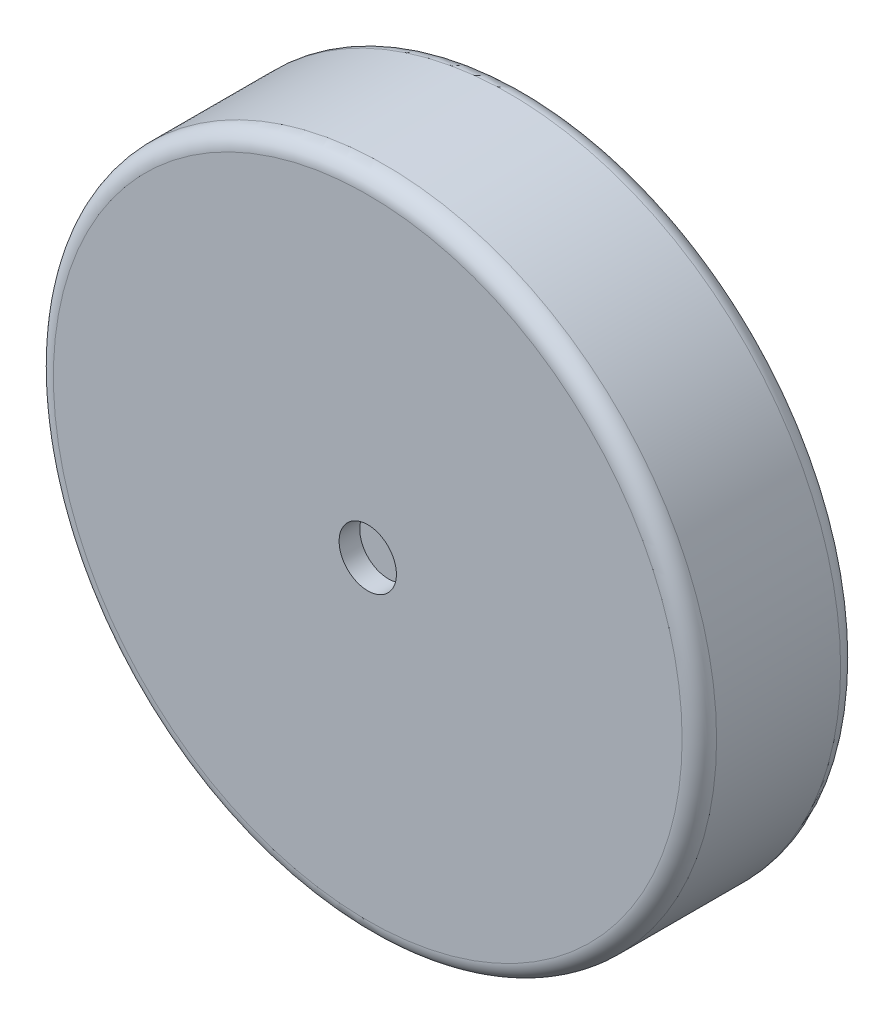
ISO-10303-21;
HEADER;
FILE_DESCRIPTION(('STEP AP214'),'2;1');
FILE_NAME('part.step','',(''),(''),'','','');
FILE_SCHEMA(('AUTOMOTIVE_DESIGN { 1 0 10303 214 1 1 1 1 }'));
ENDSEC;
DATA;
#1=APPLICATION_CONTEXT('core data for automotive mechanical design processes');
#2=APPLICATION_PROTOCOL_DEFINITION('international standard','automotive_design',2000,#1);
#3=PRODUCT_CONTEXT('',#1,'mechanical');
#4=PRODUCT('Part','Part','',(#3));
#5=PRODUCT_RELATED_PRODUCT_CATEGORY('part','',(#4));
#6=PRODUCT_DEFINITION_FORMATION('','',#4);
#7=PRODUCT_DEFINITION_CONTEXT('part definition',#1,'design');
#8=PRODUCT_DEFINITION('design','',#6,#7);
#9=PRODUCT_DEFINITION_SHAPE('','',#8);
#10=(LENGTH_UNIT() NAMED_UNIT(*) SI_UNIT(.MILLI.,.METRE.));
#11=(NAMED_UNIT(*) PLANE_ANGLE_UNIT() SI_UNIT($,.RADIAN.));
#12=(NAMED_UNIT(*) SI_UNIT($,.STERADIAN.) SOLID_ANGLE_UNIT());
#13=UNCERTAINTY_MEASURE_WITH_UNIT(LENGTH_MEASURE(1.E-05),#10,'distance_accuracy_value','');
#14=(GEOMETRIC_REPRESENTATION_CONTEXT(3) GLOBAL_UNCERTAINTY_ASSIGNED_CONTEXT((#13)) GLOBAL_UNIT_ASSIGNED_CONTEXT((#10,
#11,#12)) REPRESENTATION_CONTEXT('',''));
#15=CARTESIAN_POINT('',(0.,0.,0.));
#16=DIRECTION('',(0.,0.,1.));
#17=DIRECTION('',(1.,0.,0.));
#18=AXIS2_PLACEMENT_3D('',#15,#16,#17);
#19=CARTESIAN_POINT('',(0.,0.,23.368));
#20=DIRECTION('',(0.,0.,-1.));
#21=DIRECTION('',(-1.,0.,0.));
#22=AXIS2_PLACEMENT_3D('',#19,#20,#21);
#23=CYLINDRICAL_SURFACE('',#22,48.895);
#24=CARTESIAN_POINT('',(0.,0.,2.54));
#25=DIRECTION('',(0.,0.,1.));
#26=DIRECTION('',(1.,0.,0.));
#27=AXIS2_PLACEMENT_3D('',#24,#25,#26);
#28=CIRCLE('',#27,48.895);
#29=CARTESIAN_POINT('',(48.895,0.,2.54));
#30=VERTEX_POINT('',#29);
#31=EDGE_CURVE('E40',#30,#30,#28,.T.);
#32=ORIENTED_EDGE('',*,*,#31,.T.);
#33=EDGE_LOOP('',(#32));
#34=FACE_BOUND('',#33,.T.);
#35=CARTESIAN_POINT('',(0.,0.,20.828));
#36=DIRECTION('',(0.,0.,1.));
#37=DIRECTION('',(1.,0.,0.));
#38=AXIS2_PLACEMENT_3D('',#35,#36,#37);
#39=CIRCLE('',#38,48.895);
#40=CARTESIAN_POINT('',(48.895,0.,20.828));
#41=VERTEX_POINT('',#40);
#42=EDGE_CURVE('E44',#41,#41,#39,.F.);
#43=ORIENTED_EDGE('',*,*,#42,.T.);
#44=EDGE_LOOP('',(#43));
#45=FACE_BOUND('',#44,.T.);
#46=ADVANCED_FACE('F33',(#34,#45),#23,.T.);
#47=CARTESIAN_POINT('',(0.,0.,23.368));
#48=DIRECTION('',(0.,0.,1.));
#49=DIRECTION('',(1.,0.,0.));
#50=AXIS2_PLACEMENT_3D('',#47,#48,#49);
#51=PLANE('',#50);
#52=CARTESIAN_POINT('',(0.,0.,23.368));
#53=DIRECTION('',(0.,0.,1.));
#54=DIRECTION('',(1.,0.,0.));
#55=AXIS2_PLACEMENT_3D('',#52,#53,#54);
#56=CIRCLE('',#55,4.22569265541278);
#57=CARTESIAN_POINT('',(4.22569265541278,0.,23.368));
#58=VERTEX_POINT('',#57);
#59=EDGE_CURVE('E54',#58,#58,#56,.T.);
#60=ORIENTED_EDGE('',*,*,#59,.F.);
#61=EDGE_LOOP('',(#60));
#62=FACE_BOUND('',#61,.T.);
#63=CARTESIAN_POINT('',(0.,0.,23.368));
#64=DIRECTION('',(0.,0.,1.));
#65=DIRECTION('',(1.,0.,0.));
#66=AXIS2_PLACEMENT_3D('',#63,#64,#65);
#67=CIRCLE('',#66,46.355);
#68=CARTESIAN_POINT('',(46.355,0.,23.368));
#69=VERTEX_POINT('',#68);
#70=EDGE_CURVE('E48',#69,#69,#67,.T.);
#71=ORIENTED_EDGE('',*,*,#70,.T.);
#72=EDGE_LOOP('',(#71));
#73=FACE_BOUND('',#72,.T.);
#74=ADVANCED_FACE('F68',(#62,#73),#51,.T.);
#75=CARTESIAN_POINT('',(0.,0.,0.));
#76=DIRECTION('',(0.,0.,1.));
#77=DIRECTION('',(1.,0.,0.));
#78=AXIS2_PLACEMENT_3D('',#75,#76,#77);
#79=PLANE('',#78);
#80=CARTESIAN_POINT('',(0.,0.,0.));
#81=DIRECTION('',(0.,0.,1.));
#82=DIRECTION('',(1.,0.,0.));
#83=AXIS2_PLACEMENT_3D('',#80,#81,#82);
#84=CIRCLE('',#83,46.355);
#85=CARTESIAN_POINT('',(46.355,0.,0.));
#86=VERTEX_POINT('',#85);
#87=EDGE_CURVE('E10',#86,#86,#84,.F.);
#88=ORIENTED_EDGE('',*,*,#87,.T.);
#89=EDGE_LOOP('',(#88));
#90=FACE_BOUND('',#89,.T.);
#91=ADVANCED_FACE('F71',(#90),#79,.F.);
#92=CARTESIAN_POINT('',(0.,0.,20.828));
#93=DIRECTION('',(0.,0.,1.));
#94=DIRECTION('',(1.,0.,0.));
#95=AXIS2_PLACEMENT_3D('',#92,#93,#94);
#96=TOROIDAL_SURFACE('',#95,46.355,2.54);
#97=ORIENTED_EDGE('',*,*,#42,.F.);
#98=EDGE_LOOP('',(#97));
#99=FACE_BOUND('',#98,.T.);
#100=ORIENTED_EDGE('',*,*,#70,.F.);
#101=EDGE_LOOP('',(#100));
#102=FACE_BOUND('',#101,.T.);
#103=ADVANCED_FACE('F75',(#99,#102),#96,.T.);
#104=CARTESIAN_POINT('',(0.,0.,2.54));
#105=DIRECTION('',(0.,0.,1.));
#106=DIRECTION('',(1.,0.,0.));
#107=AXIS2_PLACEMENT_3D('',#104,#105,#106);
#108=TOROIDAL_SURFACE('',#107,46.355,2.54);
#109=ORIENTED_EDGE('',*,*,#87,.F.);
#110=EDGE_LOOP('',(#109));
#111=FACE_BOUND('',#110,.T.);
#112=ORIENTED_EDGE('',*,*,#31,.F.);
#113=EDGE_LOOP('',(#112));
#114=FACE_BOUND('',#113,.T.);
#115=ADVANCED_FACE('F35',(#111,#114),#108,.T.);
#116=CARTESIAN_POINT('',(0.,0.,20.32));
#117=DIRECTION('',(0.,0.,1.));
#118=DIRECTION('',(1.,0.,0.));
#119=AXIS2_PLACEMENT_3D('',#116,#117,#118);
#120=CYLINDRICAL_SURFACE('',#119,4.22569265541278);
#121=CARTESIAN_POINT('',(0.,0.,20.32));
#122=DIRECTION('',(0.,0.,1.));
#123=DIRECTION('',(1.,0.,0.));
#124=AXIS2_PLACEMENT_3D('',#121,#122,#123);
#125=CIRCLE('',#124,4.22569265541278);
#126=CARTESIAN_POINT('',(4.22569265541278,0.,20.32));
#127=VERTEX_POINT('',#126);
#128=EDGE_CURVE('E53',#127,#127,#125,.T.);
#129=CARTESIAN_POINT('',(4.22569265541278,0.,20.32));
#130=CARTESIAN_POINT('',(4.22569265541278,0.,20.35175));
#131=CARTESIAN_POINT('',(4.22569265541278,0.,20.3835));
#132=CARTESIAN_POINT('',(4.22569265541278,0.,20.447));
#133=CARTESIAN_POINT('',(4.22569265541278,0.,20.47875));
#134=CARTESIAN_POINT('',(4.22569265541278,0.,20.54225));
#135=CARTESIAN_POINT('',(4.22569265541278,0.,20.574));
#136=CARTESIAN_POINT('',(4.22569265541278,0.,20.6375));
#137=CARTESIAN_POINT('',(4.22569265541278,0.,20.66925));
#138=CARTESIAN_POINT('',(4.22569265541278,0.,20.73275));
#139=CARTESIAN_POINT('',(4.22569265541278,0.,20.7645));
#140=CARTESIAN_POINT('',(4.22569265541278,0.,20.828));
#141=CARTESIAN_POINT('',(4.22569265541278,0.,20.85975));
#142=CARTESIAN_POINT('',(4.22569265541278,0.,20.92325));
#143=CARTESIAN_POINT('',(4.22569265541278,0.,20.955));
#144=CARTESIAN_POINT('',(4.22569265541278,0.,21.0185));
#145=CARTESIAN_POINT('',(4.22569265541278,0.,21.05025));
#146=CARTESIAN_POINT('',(4.22569265541278,0.,21.11375));
#147=CARTESIAN_POINT('',(4.22569265541278,0.,21.1455));
#148=CARTESIAN_POINT('',(4.22569265541278,0.,21.209));
#149=CARTESIAN_POINT('',(4.22569265541278,0.,21.24075));
#150=CARTESIAN_POINT('',(4.22569265541278,0.,21.30425));
#151=CARTESIAN_POINT('',(4.22569265541278,0.,21.336));
#152=CARTESIAN_POINT('',(4.22569265541278,0.,21.3995));
#153=CARTESIAN_POINT('',(4.22569265541278,0.,21.43125));
#154=CARTESIAN_POINT('',(4.22569265541278,0.,21.49475));
#155=CARTESIAN_POINT('',(4.22569265541278,0.,21.5265));
#156=CARTESIAN_POINT('',(4.22569265541278,0.,21.59));
#157=CARTESIAN_POINT('',(4.22569265541278,0.,21.62175));
#158=CARTESIAN_POINT('',(4.22569265541278,0.,21.68525));
#159=CARTESIAN_POINT('',(4.22569265541278,0.,21.717));
#160=CARTESIAN_POINT('',(4.22569265541278,0.,21.7805));
#161=CARTESIAN_POINT('',(4.22569265541278,0.,21.81225));
#162=CARTESIAN_POINT('',(4.22569265541278,0.,21.87575));
#163=CARTESIAN_POINT('',(4.22569265541278,0.,21.9075));
#164=CARTESIAN_POINT('',(4.22569265541278,0.,21.971));
#165=CARTESIAN_POINT('',(4.22569265541278,0.,22.00275));
#166=CARTESIAN_POINT('',(4.22569265541278,0.,22.06625));
#167=CARTESIAN_POINT('',(4.22569265541278,0.,22.098));
#168=CARTESIAN_POINT('',(4.22569265541278,0.,22.1615));
#169=CARTESIAN_POINT('',(4.22569265541278,0.,22.19325));
#170=CARTESIAN_POINT('',(4.22569265541278,0.,22.25675));
#171=CARTESIAN_POINT('',(4.22569265541278,0.,22.2885));
#172=CARTESIAN_POINT('',(4.22569265541278,0.,22.352));
#173=CARTESIAN_POINT('',(4.22569265541278,0.,22.38375));
#174=CARTESIAN_POINT('',(4.22569265541278,0.,22.44725));
#175=CARTESIAN_POINT('',(4.22569265541278,0.,22.479));
#176=CARTESIAN_POINT('',(4.22569265541278,0.,22.5425));
#177=CARTESIAN_POINT('',(4.22569265541278,0.,22.57425));
#178=CARTESIAN_POINT('',(4.22569265541278,0.,22.63775));
#179=CARTESIAN_POINT('',(4.22569265541278,0.,22.6695));
#180=CARTESIAN_POINT('',(4.22569265541278,0.,22.733));
#181=CARTESIAN_POINT('',(4.22569265541278,0.,22.76475));
#182=CARTESIAN_POINT('',(4.22569265541278,0.,22.82825));
#183=CARTESIAN_POINT('',(4.22569265541278,0.,22.86));
#184=CARTESIAN_POINT('',(4.22569265541278,0.,22.9235));
#185=CARTESIAN_POINT('',(4.22569265541278,0.,22.95525));
#186=CARTESIAN_POINT('',(4.22569265541278,0.,23.01875));
#187=CARTESIAN_POINT('',(4.22569265541278,0.,23.0505));
#188=CARTESIAN_POINT('',(4.22569265541278,0.,23.114));
#189=CARTESIAN_POINT('',(4.22569265541278,0.,23.14575));
#190=CARTESIAN_POINT('',(4.22569265541278,0.,23.20925));
#191=CARTESIAN_POINT('',(4.22569265541278,0.,23.241));
#192=CARTESIAN_POINT('',(4.22569265541278,0.,23.3045));
#193=CARTESIAN_POINT('',(4.22569265541278,0.,23.33625));
#194=CARTESIAN_POINT('',(4.22569265541278,0.,23.368));
#195=B_SPLINE_CURVE_WITH_KNOTS('',3,(#129,#130,#131,#132,#133,#134,#135,#136,#137,#138,#139,
#140,#141,#142,#143,#144,#145,#146,#147,#148,#149,#150,#151,#152,#153,#154,#155,#156,#157,#158,
#159,#160,#161,#162,#163,#164,#165,#166,#167,#168,#169,#170,#171,#172,#173,#174,#175,#176,#177,
#178,#179,#180,#181,#182,#183,#184,#185,#186,#187,#188,#189,#190,#191,#192,#193,#194),
.UNSPECIFIED.,.F.,.F.,(4,2,2,2,2,2,2,2,2,2,2,2,2,2,2,2,2,2,2,2,2,2,2,2,2,2,2,2,2,2,2,2,4),(0.,
0.0952499999999981,0.1905,0.285749999999998,0.380999999999999,0.476249999999998,
0.571499999999999,0.666749999999997,0.761999999999999,0.857249999999997,0.952499999999998,
1.04775,1.143,1.23825,1.3335,1.42875,1.524,1.61925,1.7145,1.80975,1.905,2.00025,2.0955,2.19075,
2.286,2.38125,2.4765,2.57175,2.667,2.76225,2.8575,2.95275,3.048),.UNSPECIFIED.);
#196=EDGE_CURVE('BSEAM62',#127,#58,#195,.T.);
#197=ORIENTED_EDGE('',*,*,#128,.F.);
#198=ORIENTED_EDGE('',*,*,#59,.T.);
#199=ORIENTED_EDGE('',*,*,#196,.T.);
#200=ORIENTED_EDGE('',*,*,#196,.F.);
#201=EDGE_LOOP('',(#197,#199,#198,#200));
#202=FACE_BOUND('',#201,.T.);
#203=ADVANCED_FACE('F62',(#202),#120,.F.);
#204=CARTESIAN_POINT('',(0.,0.,20.32));
#205=DIRECTION('',(0.,0.,1.));
#206=DIRECTION('',(1.,0.,0.));
#207=AXIS2_PLACEMENT_3D('',#204,#205,#206);
#208=PLANE('',#207);
#209=ORIENTED_EDGE('',*,*,#128,.T.);
#210=EDGE_LOOP('',(#209));
#211=FACE_BOUND('',#210,.T.);
#212=ADVANCED_FACE('F60',(#211),#208,.T.);
#213=CLOSED_SHELL('',(#46,#74,#91,#103,#115,#203,#212));
#214=MANIFOLD_SOLID_BREP('B2',#213);
#215=ADVANCED_BREP_SHAPE_REPRESENTATION('',(#18,#214),#14);
#216=SHAPE_DEFINITION_REPRESENTATION(#9,#215);
ENDSEC;
END-ISO-10303-21;
